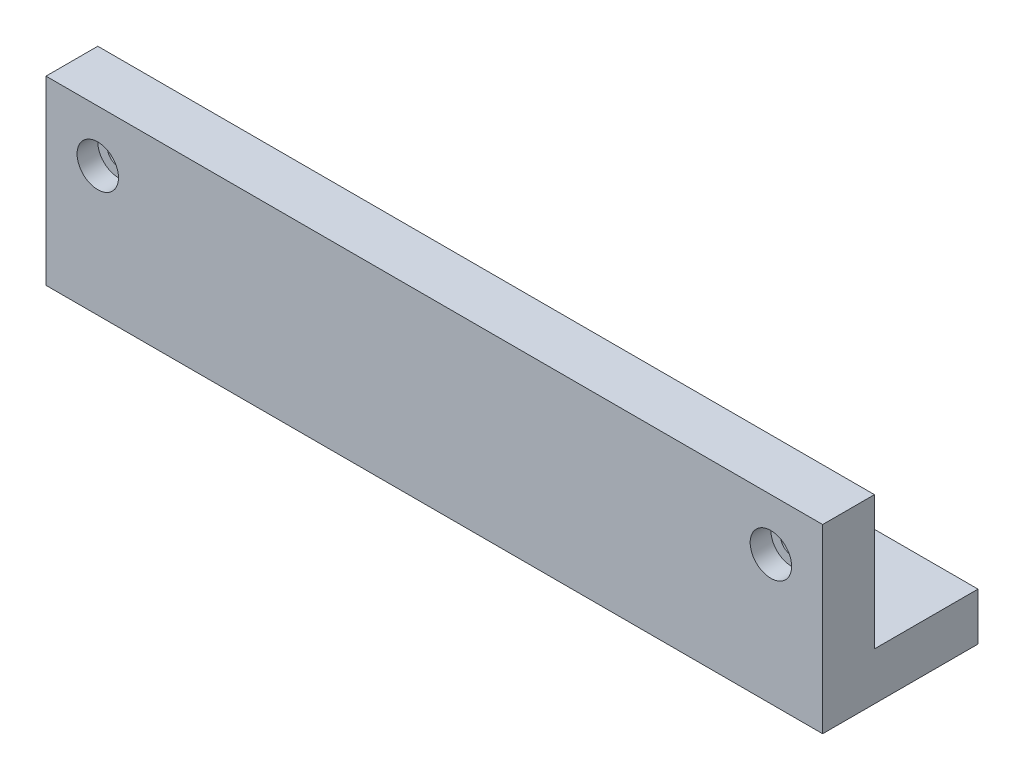
ISO-10303-21;
HEADER;
FILE_DESCRIPTION(('STEP AP214'),'2;1');
FILE_NAME('part.step','',(''),(''),'','','');
FILE_SCHEMA(('AUTOMOTIVE_DESIGN { 1 0 10303 214 1 1 1 1 }'));
ENDSEC;
DATA;
#1=APPLICATION_CONTEXT('core data for automotive mechanical design processes');
#2=APPLICATION_PROTOCOL_DEFINITION('international standard','automotive_design',2000,#1);
#3=PRODUCT_CONTEXT('',#1,'mechanical');
#4=PRODUCT('Part','Part','',(#3));
#5=PRODUCT_RELATED_PRODUCT_CATEGORY('part','',(#4));
#6=PRODUCT_DEFINITION_FORMATION('','',#4);
#7=PRODUCT_DEFINITION_CONTEXT('part definition',#1,'design');
#8=PRODUCT_DEFINITION('design','',#6,#7);
#9=PRODUCT_DEFINITION_SHAPE('','',#8);
#10=(LENGTH_UNIT() NAMED_UNIT(*) SI_UNIT(.MILLI.,.METRE.));
#11=(NAMED_UNIT(*) PLANE_ANGLE_UNIT() SI_UNIT($,.RADIAN.));
#12=(NAMED_UNIT(*) SI_UNIT($,.STERADIAN.) SOLID_ANGLE_UNIT());
#13=UNCERTAINTY_MEASURE_WITH_UNIT(LENGTH_MEASURE(1.E-05),#10,'distance_accuracy_value','');
#14=(GEOMETRIC_REPRESENTATION_CONTEXT(3) GLOBAL_UNCERTAINTY_ASSIGNED_CONTEXT((#13)) GLOBAL_UNIT_ASSIGNED_CONTEXT((#10,
#11,#12)) REPRESENTATION_CONTEXT('',''));
#15=CARTESIAN_POINT('',(0.,0.,0.));
#16=DIRECTION('',(0.,0.,1.));
#17=DIRECTION('',(1.,0.,0.));
#18=AXIS2_PLACEMENT_3D('',#15,#16,#17);
#19=CARTESIAN_POINT('',(25.,2.55,4.));
#20=DIRECTION('',(1.,0.,0.));
#21=DIRECTION('',(0.,0.,-1.));
#22=AXIS2_PLACEMENT_3D('',#19,#20,#21);
#23=PLANE('',#22);
#24=DIRECTION('',(0.,0.,-1.));
#25=VECTOR('',#24,1.);
#26=CARTESIAN_POINT('',(25.,2.55,4.));
#27=LINE('',#26,#25);
#28=CARTESIAN_POINT('',(25.,2.55,4.));
#29=VERTEX_POINT('',#28);
#30=CARTESIAN_POINT('',(25.,2.55,0.));
#31=VERTEX_POINT('',#30);
#32=EDGE_CURVE('E69',#29,#31,#27,.T.);
#33=ORIENTED_EDGE('',*,*,#32,.F.);
#34=DIRECTION('',(0.,-1.,0.));
#35=VECTOR('',#34,1.);
#36=CARTESIAN_POINT('',(25.,10.,4.));
#37=LINE('',#36,#35);
#38=CARTESIAN_POINT('',(25.,-2.55,4.));
#39=VERTEX_POINT('',#38);
#40=EDGE_CURVE('E11',#29,#39,#37,.T.);
#41=ORIENTED_EDGE('',*,*,#40,.T.);
#42=DIRECTION('',(0.,0.,-1.));
#43=VECTOR('',#42,1.);
#44=CARTESIAN_POINT('',(25.,-2.55,4.));
#45=LINE('',#44,#43);
#46=CARTESIAN_POINT('',(25.,-2.55,0.));
#47=VERTEX_POINT('',#46);
#48=EDGE_CURVE('E93',#39,#47,#45,.T.);
#49=ORIENTED_EDGE('',*,*,#48,.T.);
#50=DIRECTION('',(0.,-1.,0.));
#51=VECTOR('',#50,1.);
#52=CARTESIAN_POINT('',(25.,2.55,0.));
#53=LINE('',#52,#51);
#54=EDGE_CURVE('E97',#31,#47,#53,.T.);
#55=ORIENTED_EDGE('',*,*,#54,.F.);
#56=EDGE_LOOP('',(#33,#41,#49,#55));
#57=FACE_BOUND('',#56,.T.);
#58=ADVANCED_FACE('F43',(#57),#23,.T.);
#59=CARTESIAN_POINT('',(-25.,2.55,4.));
#60=DIRECTION('',(1.,0.,0.));
#61=DIRECTION('',(0.,1.,0.));
#62=AXIS2_PLACEMENT_3D('',#59,#60,#61);
#63=PLANE('',#62);
#64=DIRECTION('',(0.,-1.,0.));
#65=VECTOR('',#64,1.);
#66=CARTESIAN_POINT('',(-25.,10.,4.));
#67=LINE('',#66,#65);
#68=CARTESIAN_POINT('',(-25.,2.55,4.));
#69=VERTEX_POINT('',#68);
#70=CARTESIAN_POINT('',(-25.,-2.55,4.));
#71=VERTEX_POINT('',#70);
#72=EDGE_CURVE('E53',#69,#71,#67,.T.);
#73=ORIENTED_EDGE('',*,*,#72,.F.);
#74=DIRECTION('',(0.,0.,-1.));
#75=VECTOR('',#74,1.);
#76=CARTESIAN_POINT('',(-25.,2.55,4.));
#77=LINE('',#76,#75);
#78=CARTESIAN_POINT('',(-25.,2.55,0.));
#79=VERTEX_POINT('',#78);
#80=EDGE_CURVE('E94',#69,#79,#77,.T.);
#81=ORIENTED_EDGE('',*,*,#80,.T.);
#82=DIRECTION('',(0.,-1.,0.));
#83=VECTOR('',#82,1.);
#84=CARTESIAN_POINT('',(-25.,2.55,0.));
#85=LINE('',#84,#83);
#86=CARTESIAN_POINT('',(-25.,-2.55,0.));
#87=VERTEX_POINT('',#86);
#88=EDGE_CURVE('E107',#79,#87,#85,.T.);
#89=ORIENTED_EDGE('',*,*,#88,.T.);
#90=DIRECTION('',(0.,0.,-1.));
#91=VECTOR('',#90,1.);
#92=CARTESIAN_POINT('',(-25.,-2.55,4.));
#93=LINE('',#92,#91);
#94=EDGE_CURVE('E120',#71,#87,#93,.T.);
#95=ORIENTED_EDGE('',*,*,#94,.F.);
#96=EDGE_LOOP('',(#73,#81,#89,#95));
#97=FACE_BOUND('',#96,.T.);
#98=ADVANCED_FACE('F45',(#97),#63,.F.);
#99=CARTESIAN_POINT('',(-25.,-2.55,4.));
#100=DIRECTION('',(0.,1.,0.));
#101=DIRECTION('',(0.,0.,1.));
#102=AXIS2_PLACEMENT_3D('',#99,#100,#101);
#103=PLANE('',#102);
#104=DIRECTION('',(1.,0.,0.));
#105=VECTOR('',#104,1.);
#106=CARTESIAN_POINT('',(-25.,-2.55,0.));
#107=LINE('',#106,#105);
#108=EDGE_CURVE('E102',#87,#47,#107,.T.);
#109=ORIENTED_EDGE('',*,*,#108,.T.);
#110=ORIENTED_EDGE('',*,*,#48,.F.);
#111=DIRECTION('',(1.,0.,0.));
#112=VECTOR('',#111,1.);
#113=CARTESIAN_POINT('',(-25.,-2.55,4.));
#114=LINE('',#113,#112);
#115=EDGE_CURVE('E109',#71,#39,#114,.T.);
#116=ORIENTED_EDGE('',*,*,#115,.F.);
#117=ORIENTED_EDGE('',*,*,#94,.T.);
#118=EDGE_LOOP('',(#109,#110,#116,#117));
#119=FACE_BOUND('',#118,.T.);
#120=ADVANCED_FACE('F218',(#119),#103,.F.);
#121=CARTESIAN_POINT('',(-25.,2.55,4.));
#122=DIRECTION('',(0.,1.,0.));
#123=DIRECTION('',(0.,0.,1.));
#124=AXIS2_PLACEMENT_3D('',#121,#122,#123);
#125=PLANE('',#124);
#126=DIRECTION('',(1.,0.,0.));
#127=VECTOR('',#126,1.);
#128=CARTESIAN_POINT('',(-25.,2.55,0.));
#129=LINE('',#128,#127);
#130=EDGE_CURVE('E88',#79,#31,#129,.T.);
#131=ORIENTED_EDGE('',*,*,#130,.F.);
#132=ORIENTED_EDGE('',*,*,#80,.F.);
#133=DIRECTION('',(1.,0.,0.));
#134=VECTOR('',#133,1.);
#135=CARTESIAN_POINT('',(-25.,2.55,4.));
#136=LINE('',#135,#134);
#137=EDGE_CURVE('E90',#69,#29,#136,.T.);
#138=ORIENTED_EDGE('',*,*,#137,.T.);
#139=ORIENTED_EDGE('',*,*,#32,.T.);
#140=EDGE_LOOP('',(#131,#132,#138,#139));
#141=FACE_BOUND('',#140,.T.);
#142=ADVANCED_FACE('F85',(#141),#125,.T.);
#143=CARTESIAN_POINT('',(0.,0.,0.));
#144=DIRECTION('',(0.,0.,1.));
#145=DIRECTION('',(1.,0.,0.));
#146=AXIS2_PLACEMENT_3D('',#143,#144,#145);
#147=PLANE('',#146);
#148=ORIENTED_EDGE('',*,*,#88,.F.);
#149=ORIENTED_EDGE('',*,*,#130,.T.);
#150=ORIENTED_EDGE('',*,*,#54,.T.);
#151=ORIENTED_EDGE('',*,*,#108,.F.);
#152=EDGE_LOOP('',(#148,#149,#150,#151));
#153=FACE_BOUND('',#152,.T.);
#154=ADVANCED_FACE('F105',(#153),#147,.F.);
#155=CARTESIAN_POINT('',(0.,0.,4.));
#156=DIRECTION('',(0.,0.,1.));
#157=DIRECTION('',(1.,0.,0.));
#158=AXIS2_PLACEMENT_3D('',#155,#156,#157);
#159=PLANE('',#158);
#160=CARTESIAN_POINT('',(-65.,0.,4.));
#161=DIRECTION('',(0.,0.,1.));
#162=DIRECTION('',(1.,0.,0.));
#163=AXIS2_PLACEMENT_3D('',#160,#161,#162);
#164=CIRCLE('',#163,2.15);
#165=CARTESIAN_POINT('',(-62.85,0.,4.));
#166=VERTEX_POINT('',#165);
#167=EDGE_CURVE('E47',#166,#166,#164,.T.);
#168=ORIENTED_EDGE('',*,*,#167,.T.);
#169=EDGE_LOOP('',(#168));
#170=FACE_BOUND('',#169,.T.);
#171=CARTESIAN_POINT('',(65.,0.,4.));
#172=DIRECTION('',(0.,0.,1.));
#173=DIRECTION('',(1.,0.,0.));
#174=AXIS2_PLACEMENT_3D('',#171,#172,#173);
#175=CIRCLE('',#174,2.15);
#176=CARTESIAN_POINT('',(67.15,0.,4.));
#177=VERTEX_POINT('',#176);
#178=EDGE_CURVE('E123',#177,#177,#175,.T.);
#179=ORIENTED_EDGE('',*,*,#178,.T.);
#180=EDGE_LOOP('',(#179));
#181=FACE_BOUND('',#180,.T.);
#182=DIRECTION('',(-1.,0.,0.));
#183=VECTOR('',#182,1.);
#184=CARTESIAN_POINT('',(-25.,10.,4.));
#185=LINE('',#184,#183);
#186=CARTESIAN_POINT('',(75.,10.,4.));
#187=VERTEX_POINT('',#186);
#188=CARTESIAN_POINT('',(-75.,9.99999999999997,4.));
#189=VERTEX_POINT('',#188);
#190=EDGE_CURVE('E202',#187,#189,#185,.T.);
#191=ORIENTED_EDGE('',*,*,#190,.F.);
#192=DIRECTION('',(0.,-1.,0.));
#193=VECTOR('',#192,1.);
#194=CARTESIAN_POINT('',(75.,10.,4.));
#195=LINE('',#194,#193);
#196=CARTESIAN_POINT('',(75.,-15.8,4.));
#197=VERTEX_POINT('',#196);
#198=EDGE_CURVE('E178',#187,#197,#195,.T.);
#199=ORIENTED_EDGE('',*,*,#198,.T.);
#200=DIRECTION('',(-1.,0.,0.));
#201=VECTOR('',#200,1.);
#202=CARTESIAN_POINT('',(75.,-15.8,4.));
#203=LINE('',#202,#201);
#204=CARTESIAN_POINT('',(-75.,-15.8,4.));
#205=VERTEX_POINT('',#204);
#206=EDGE_CURVE('E132',#197,#205,#203,.T.);
#207=ORIENTED_EDGE('',*,*,#206,.T.);
#208=DIRECTION('',(0.,-1.,0.));
#209=VECTOR('',#208,1.);
#210=CARTESIAN_POINT('',(-75.,9.99999999999997,4.));
#211=LINE('',#210,#209);
#212=EDGE_CURVE('E189',#189,#205,#211,.T.);
#213=ORIENTED_EDGE('',*,*,#212,.F.);
#214=EDGE_LOOP('',(#191,#199,#207,#213));
#215=FACE_BOUND('',#214,.T.);
#216=ORIENTED_EDGE('',*,*,#40,.F.);
#217=ORIENTED_EDGE('',*,*,#137,.F.);
#218=ORIENTED_EDGE('',*,*,#72,.T.);
#219=ORIENTED_EDGE('',*,*,#115,.T.);
#220=EDGE_LOOP('',(#216,#217,#218,#219));
#221=FACE_BOUND('',#220,.T.);
#222=ADVANCED_FACE('F255',(#170,#181,#215,#221),#159,.F.);
#223=CARTESIAN_POINT('',(-25.,10.,14.));
#224=DIRECTION('',(0.,-1.,0.));
#225=DIRECTION('',(0.,0.,-1.));
#226=AXIS2_PLACEMENT_3D('',#223,#224,#225);
#227=PLANE('',#226);
#228=ORIENTED_EDGE('',*,*,#190,.T.);
#229=DIRECTION('',(0.,0.,-1.));
#230=VECTOR('',#229,1.);
#231=CARTESIAN_POINT('',(-75.,9.99999999999997,4.));
#232=LINE('',#231,#230);
#233=CARTESIAN_POINT('',(-75.,9.99999999999997,14.));
#234=VERTEX_POINT('',#233);
#235=EDGE_CURVE('E198',#234,#189,#232,.T.);
#236=ORIENTED_EDGE('',*,*,#235,.F.);
#237=DIRECTION('',(-1.,0.,0.));
#238=VECTOR('',#237,1.);
#239=CARTESIAN_POINT('',(-25.,10.,14.));
#240=LINE('',#239,#238);
#241=CARTESIAN_POINT('',(75.,10.,14.));
#242=VERTEX_POINT('',#241);
#243=EDGE_CURVE('E206',#242,#234,#240,.T.);
#244=ORIENTED_EDGE('',*,*,#243,.F.);
#245=DIRECTION('',(0.,0.,-1.));
#246=VECTOR('',#245,1.);
#247=CARTESIAN_POINT('',(75.,10.,4.));
#248=LINE('',#247,#246);
#249=EDGE_CURVE('E182',#242,#187,#248,.T.);
#250=ORIENTED_EDGE('',*,*,#249,.T.);
#251=EDGE_LOOP('',(#228,#236,#244,#250));
#252=FACE_BOUND('',#251,.T.);
#253=ADVANCED_FACE('F273',(#252),#227,.F.);
#254=CARTESIAN_POINT('',(0.,0.,14.));
#255=DIRECTION('',(0.,0.,1.));
#256=DIRECTION('',(1.,0.,0.));
#257=AXIS2_PLACEMENT_3D('',#254,#255,#256);
#258=PLANE('',#257);
#259=CARTESIAN_POINT('',(-65.,0.,14.));
#260=DIRECTION('',(0.,0.,1.));
#261=DIRECTION('',(1.,0.,0.));
#262=AXIS2_PLACEMENT_3D('',#259,#260,#261);
#263=CIRCLE('',#262,4.);
#264=CARTESIAN_POINT('',(-61.,0.,14.));
#265=VERTEX_POINT('',#264);
#266=EDGE_CURVE('E522',#265,#265,#263,.T.);
#267=ORIENTED_EDGE('',*,*,#266,.F.);
#268=EDGE_LOOP('',(#267));
#269=FACE_BOUND('',#268,.T.);
#270=CARTESIAN_POINT('',(65.,0.,14.));
#271=DIRECTION('',(0.,0.,1.));
#272=DIRECTION('',(1.,0.,0.));
#273=AXIS2_PLACEMENT_3D('',#270,#271,#272);
#274=CIRCLE('',#273,4.);
#275=CARTESIAN_POINT('',(69.,0.,14.));
#276=VERTEX_POINT('',#275);
#277=EDGE_CURVE('E141',#276,#276,#274,.T.);
#278=ORIENTED_EDGE('',*,*,#277,.F.);
#279=EDGE_LOOP('',(#278));
#280=FACE_BOUND('',#279,.T.);
#281=DIRECTION('',(0.,1.,0.));
#282=VECTOR('',#281,1.);
#283=CARTESIAN_POINT('',(-75.,9.99999999999997,14.));
#284=LINE('',#283,#282);
#285=CARTESIAN_POINT('',(-75.,-25.,14.));
#286=VERTEX_POINT('',#285);
#287=EDGE_CURVE('E194',#286,#234,#284,.T.);
#288=ORIENTED_EDGE('',*,*,#287,.F.);
#289=DIRECTION('',(-1.,0.,0.));
#290=VECTOR('',#289,1.);
#291=CARTESIAN_POINT('',(-75.,-25.,14.));
#292=LINE('',#291,#290);
#293=CARTESIAN_POINT('',(75.,-25.,14.));
#294=VERTEX_POINT('',#293);
#295=EDGE_CURVE('E166',#294,#286,#292,.T.);
#296=ORIENTED_EDGE('',*,*,#295,.F.);
#297=DIRECTION('',(0.,1.,0.));
#298=VECTOR('',#297,1.);
#299=CARTESIAN_POINT('',(75.,10.,14.));
#300=LINE('',#299,#298);
#301=EDGE_CURVE('E186',#294,#242,#300,.T.);
#302=ORIENTED_EDGE('',*,*,#301,.T.);
#303=ORIENTED_EDGE('',*,*,#243,.T.);
#304=EDGE_LOOP('',(#288,#296,#302,#303));
#305=FACE_BOUND('',#304,.T.);
#306=ADVANCED_FACE('F276',(#269,#280,#305),#258,.T.);
#307=CARTESIAN_POINT('',(-75.,0.,0.));
#308=DIRECTION('',(-1.,0.,0.));
#309=DIRECTION('',(0.,-1.,0.));
#310=AXIS2_PLACEMENT_3D('',#307,#308,#309);
#311=PLANE('',#310);
#312=DIRECTION('',(0.,0.,-1.));
#313=VECTOR('',#312,1.);
#314=CARTESIAN_POINT('',(-75.,-15.8,4.));
#315=LINE('',#314,#313);
#316=CARTESIAN_POINT('',(-75.,-15.8,-16.));
#317=VERTEX_POINT('',#316);
#318=EDGE_CURVE('E148',#205,#317,#315,.T.);
#319=ORIENTED_EDGE('',*,*,#318,.T.);
#320=DIRECTION('',(0.,1.,0.));
#321=VECTOR('',#320,1.);
#322=CARTESIAN_POINT('',(-75.,-25.,-16.));
#323=LINE('',#322,#321);
#324=CARTESIAN_POINT('',(-75.,-25.,-16.));
#325=VERTEX_POINT('',#324);
#326=EDGE_CURVE('E174',#325,#317,#323,.T.);
#327=ORIENTED_EDGE('',*,*,#326,.F.);
#328=DIRECTION('',(0.,0.,-1.));
#329=VECTOR('',#328,1.);
#330=CARTESIAN_POINT('',(-75.,-25.,14.));
#331=LINE('',#330,#329);
#332=EDGE_CURVE('E152',#286,#325,#331,.T.);
#333=ORIENTED_EDGE('',*,*,#332,.F.);
#334=ORIENTED_EDGE('',*,*,#287,.T.);
#335=ORIENTED_EDGE('',*,*,#235,.T.);
#336=ORIENTED_EDGE('',*,*,#212,.T.);
#337=EDGE_LOOP('',(#319,#327,#333,#334,#335,#336));
#338=FACE_BOUND('',#337,.T.);
#339=ADVANCED_FACE('F269',(#338),#311,.T.);
#340=CARTESIAN_POINT('',(75.,0.,0.));
#341=DIRECTION('',(1.,0.,0.));
#342=DIRECTION('',(0.,-1.,0.));
#343=AXIS2_PLACEMENT_3D('',#340,#341,#342);
#344=PLANE('',#343);
#345=DIRECTION('',(0.,0.,-1.));
#346=VECTOR('',#345,1.);
#347=CARTESIAN_POINT('',(75.,-15.8,4.));
#348=LINE('',#347,#346);
#349=CARTESIAN_POINT('',(75.,-15.8,-16.));
#350=VERTEX_POINT('',#349);
#351=EDGE_CURVE('E61',#197,#350,#348,.T.);
#352=ORIENTED_EDGE('',*,*,#351,.F.);
#353=ORIENTED_EDGE('',*,*,#198,.F.);
#354=ORIENTED_EDGE('',*,*,#249,.F.);
#355=ORIENTED_EDGE('',*,*,#301,.F.);
#356=DIRECTION('',(0.,0.,1.));
#357=VECTOR('',#356,1.);
#358=CARTESIAN_POINT('',(75.,-25.,14.));
#359=LINE('',#358,#357);
#360=CARTESIAN_POINT('',(75.,-25.,-16.));
#361=VERTEX_POINT('',#360);
#362=EDGE_CURVE('E162',#361,#294,#359,.T.);
#363=ORIENTED_EDGE('',*,*,#362,.F.);
#364=DIRECTION('',(0.,1.,0.));
#365=VECTOR('',#364,1.);
#366=CARTESIAN_POINT('',(75.,-25.,-16.));
#367=LINE('',#366,#365);
#368=EDGE_CURVE('E170',#361,#350,#367,.T.);
#369=ORIENTED_EDGE('',*,*,#368,.T.);
#370=EDGE_LOOP('',(#352,#353,#354,#355,#363,#369));
#371=FACE_BOUND('',#370,.T.);
#372=ADVANCED_FACE('F262',(#371),#344,.T.);
#373=CARTESIAN_POINT('',(-75.,-25.,-16.));
#374=DIRECTION('',(0.,0.,1.));
#375=DIRECTION('',(1.,0.,0.));
#376=AXIS2_PLACEMENT_3D('',#373,#374,#375);
#377=PLANE('',#376);
#378=ORIENTED_EDGE('',*,*,#326,.T.);
#379=DIRECTION('',(-1.,0.,0.));
#380=VECTOR('',#379,1.);
#381=CARTESIAN_POINT('',(75.,-15.8,-16.));
#382=LINE('',#381,#380);
#383=EDGE_CURVE('E126',#350,#317,#382,.T.);
#384=ORIENTED_EDGE('',*,*,#383,.F.);
#385=ORIENTED_EDGE('',*,*,#368,.F.);
#386=DIRECTION('',(1.,0.,0.));
#387=VECTOR('',#386,1.);
#388=CARTESIAN_POINT('',(-75.,-25.,-16.));
#389=LINE('',#388,#387);
#390=EDGE_CURVE('E158',#325,#361,#389,.T.);
#391=ORIENTED_EDGE('',*,*,#390,.F.);
#392=EDGE_LOOP('',(#378,#384,#385,#391));
#393=FACE_BOUND('',#392,.T.);
#394=ADVANCED_FACE('F266',(#393),#377,.F.);
#395=CARTESIAN_POINT('',(0.,-25.,0.));
#396=DIRECTION('',(0.,-1.,0.));
#397=DIRECTION('',(0.,0.,-1.));
#398=AXIS2_PLACEMENT_3D('',#395,#396,#397);
#399=PLANE('',#398);
#400=ORIENTED_EDGE('',*,*,#332,.T.);
#401=ORIENTED_EDGE('',*,*,#390,.T.);
#402=ORIENTED_EDGE('',*,*,#362,.T.);
#403=ORIENTED_EDGE('',*,*,#295,.T.);
#404=EDGE_LOOP('',(#400,#401,#402,#403));
#405=FACE_BOUND('',#404,.T.);
#406=ADVANCED_FACE('F278',(#405),#399,.T.);
#407=CARTESIAN_POINT('',(75.,-15.8,4.));
#408=DIRECTION('',(0.,-1.,0.));
#409=DIRECTION('',(0.,0.,-1.));
#410=AXIS2_PLACEMENT_3D('',#407,#408,#409);
#411=PLANE('',#410);
#412=ORIENTED_EDGE('',*,*,#383,.T.);
#413=ORIENTED_EDGE('',*,*,#318,.F.);
#414=ORIENTED_EDGE('',*,*,#206,.F.);
#415=ORIENTED_EDGE('',*,*,#351,.T.);
#416=EDGE_LOOP('',(#412,#413,#414,#415));
#417=FACE_BOUND('',#416,.T.);
#418=ADVANCED_FACE('F261',(#417),#411,.F.);
#419=CARTESIAN_POINT('',(65.,0.,14.));
#420=DIRECTION('',(0.,0.,1.));
#421=DIRECTION('',(1.,0.,0.));
#422=AXIS2_PLACEMENT_3D('',#419,#420,#421);
#423=CYLINDRICAL_SURFACE('',#422,2.15);
#424=CARTESIAN_POINT('',(65.,0.,10.));
#425=DIRECTION('',(0.,0.,1.));
#426=DIRECTION('',(1.,0.,0.));
#427=AXIS2_PLACEMENT_3D('',#424,#425,#426);
#428=CIRCLE('',#427,2.15);
#429=CARTESIAN_POINT('',(67.15,0.,10.));
#430=VERTEX_POINT('',#429);
#431=EDGE_CURVE('E127',#430,#430,#428,.T.);
#432=ORIENTED_EDGE('',*,*,#431,.T.);
#433=EDGE_LOOP('',(#432));
#434=FACE_BOUND('',#433,.T.);
#435=ORIENTED_EDGE('',*,*,#178,.F.);
#436=EDGE_LOOP('',(#435));
#437=FACE_BOUND('',#436,.T.);
#438=ADVANCED_FACE('F285',(#434,#437),#423,.F.);
#439=CARTESIAN_POINT('',(67.15,0.,10.));
#440=DIRECTION('',(0.,0.,-1.));
#441=DIRECTION('',(-1.,0.,0.));
#442=AXIS2_PLACEMENT_3D('',#439,#440,#441);
#443=PLANE('',#442);
#444=ORIENTED_EDGE('',*,*,#431,.F.);
#445=EDGE_LOOP('',(#444));
#446=FACE_BOUND('',#445,.T.);
#447=CARTESIAN_POINT('',(65.,0.,10.));
#448=DIRECTION('',(0.,0.,1.));
#449=DIRECTION('',(1.,0.,0.));
#450=AXIS2_PLACEMENT_3D('',#447,#448,#449);
#451=CIRCLE('',#450,4.);
#452=CARTESIAN_POINT('',(69.,0.,10.));
#453=VERTEX_POINT('',#452);
#454=EDGE_CURVE('E135',#453,#453,#451,.T.);
#455=ORIENTED_EDGE('',*,*,#454,.T.);
#456=EDGE_LOOP('',(#455));
#457=FACE_BOUND('',#456,.T.);
#458=ADVANCED_FACE('F358',(#446,#457),#443,.F.);
#459=CARTESIAN_POINT('',(65.,0.,14.));
#460=DIRECTION('',(0.,0.,1.));
#461=DIRECTION('',(1.,0.,0.));
#462=AXIS2_PLACEMENT_3D('',#459,#460,#461);
#463=CYLINDRICAL_SURFACE('',#462,4.);
#464=ORIENTED_EDGE('',*,*,#454,.F.);
#465=EDGE_LOOP('',(#464));
#466=FACE_BOUND('',#465,.T.);
#467=ORIENTED_EDGE('',*,*,#277,.T.);
#468=EDGE_LOOP('',(#467));
#469=FACE_BOUND('',#468,.T.);
#470=ADVANCED_FACE('F368',(#466,#469),#463,.F.);
#471=CARTESIAN_POINT('',(-65.,0.,14.));
#472=DIRECTION('',(0.,0.,1.));
#473=DIRECTION('',(1.,0.,0.));
#474=AXIS2_PLACEMENT_3D('',#471,#472,#473);
#475=CYLINDRICAL_SURFACE('',#474,2.15);
#476=CARTESIAN_POINT('',(-65.,0.,10.));
#477=DIRECTION('',(0.,0.,1.));
#478=DIRECTION('',(1.,0.,0.));
#479=AXIS2_PLACEMENT_3D('',#476,#477,#478);
#480=CIRCLE('',#479,2.15);
#481=CARTESIAN_POINT('',(-62.85,0.,10.));
#482=VERTEX_POINT('',#481);
#483=EDGE_CURVE('E526',#482,#482,#480,.T.);
#484=ORIENTED_EDGE('',*,*,#483,.T.);
#485=EDGE_LOOP('',(#484));
#486=FACE_BOUND('',#485,.T.);
#487=ORIENTED_EDGE('',*,*,#167,.F.);
#488=EDGE_LOOP('',(#487));
#489=FACE_BOUND('',#488,.T.);
#490=ADVANCED_FACE('F379',(#486,#489),#475,.F.);
#491=CARTESIAN_POINT('',(-62.85,0.,10.));
#492=DIRECTION('',(0.,0.,-1.));
#493=DIRECTION('',(-1.,0.,0.));
#494=AXIS2_PLACEMENT_3D('',#491,#492,#493);
#495=PLANE('',#494);
#496=ORIENTED_EDGE('',*,*,#483,.F.);
#497=EDGE_LOOP('',(#496));
#498=FACE_BOUND('',#497,.T.);
#499=CARTESIAN_POINT('',(-65.,0.,10.));
#500=DIRECTION('',(0.,0.,1.));
#501=DIRECTION('',(1.,0.,0.));
#502=AXIS2_PLACEMENT_3D('',#499,#500,#501);
#503=CIRCLE('',#502,4.);
#504=CARTESIAN_POINT('',(-61.,0.,10.));
#505=VERTEX_POINT('',#504);
#506=EDGE_CURVE('E519',#505,#505,#503,.T.);
#507=ORIENTED_EDGE('',*,*,#506,.T.);
#508=EDGE_LOOP('',(#507));
#509=FACE_BOUND('',#508,.T.);
#510=ADVANCED_FACE('F390',(#498,#509),#495,.F.);
#511=CARTESIAN_POINT('',(-65.,0.,14.));
#512=DIRECTION('',(0.,0.,1.));
#513=DIRECTION('',(1.,0.,0.));
#514=AXIS2_PLACEMENT_3D('',#511,#512,#513);
#515=CYLINDRICAL_SURFACE('',#514,4.);
#516=ORIENTED_EDGE('',*,*,#506,.F.);
#517=EDGE_LOOP('',(#516));
#518=FACE_BOUND('',#517,.T.);
#519=ORIENTED_EDGE('',*,*,#266,.T.);
#520=EDGE_LOOP('',(#519));
#521=FACE_BOUND('',#520,.T.);
#522=ADVANCED_FACE('F401',(#518,#521),#515,.F.);
#523=CLOSED_SHELL('',(#58,#98,#120,#142,#154,#222,#253,#306,#339,#372,#394,#406,#418,#438,#458,
#470,#490,#510,#522));
#524=MANIFOLD_SOLID_BREP('B2',#523);
#525=ADVANCED_BREP_SHAPE_REPRESENTATION('',(#18,#524),#14);
#526=SHAPE_DEFINITION_REPRESENTATION(#9,#525);
ENDSEC;
END-ISO-10303-21;
